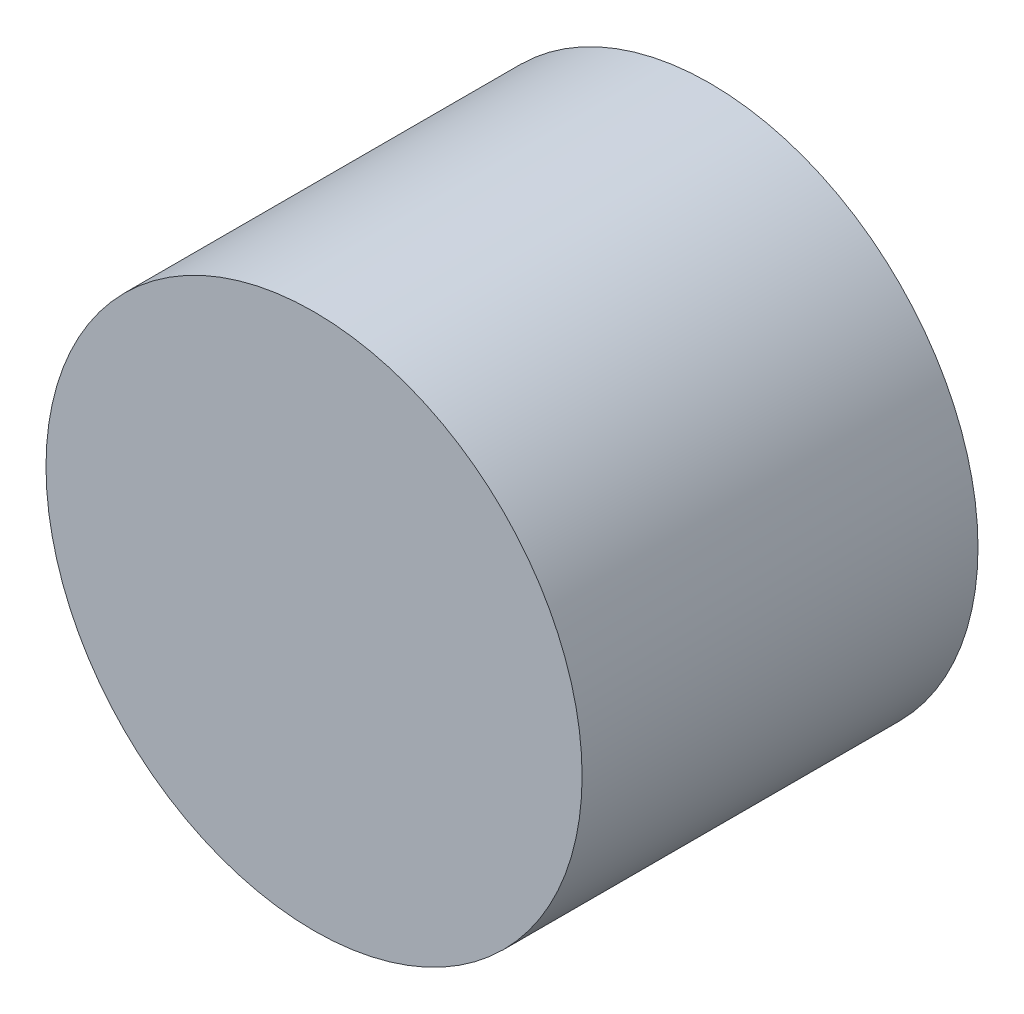
ISO-10303-21;
HEADER;
FILE_DESCRIPTION(('STEP AP214'),'2;1');
FILE_NAME('part.step','',(''),(''),'','','');
FILE_SCHEMA(('AUTOMOTIVE_DESIGN { 1 0 10303 214 1 1 1 1 }'));
ENDSEC;
DATA;
#1=APPLICATION_CONTEXT('core data for automotive mechanical design processes');
#2=APPLICATION_PROTOCOL_DEFINITION('international standard','automotive_design',2000,#1);
#3=PRODUCT_CONTEXT('',#1,'mechanical');
#4=PRODUCT('Part','Part','',(#3));
#5=PRODUCT_RELATED_PRODUCT_CATEGORY('part','',(#4));
#6=PRODUCT_DEFINITION_FORMATION('','',#4);
#7=PRODUCT_DEFINITION_CONTEXT('part definition',#1,'design');
#8=PRODUCT_DEFINITION('design','',#6,#7);
#9=PRODUCT_DEFINITION_SHAPE('','',#8);
#10=(LENGTH_UNIT() NAMED_UNIT(*) SI_UNIT(.MILLI.,.METRE.));
#11=(NAMED_UNIT(*) PLANE_ANGLE_UNIT() SI_UNIT($,.RADIAN.));
#12=(NAMED_UNIT(*) SI_UNIT($,.STERADIAN.) SOLID_ANGLE_UNIT());
#13=UNCERTAINTY_MEASURE_WITH_UNIT(LENGTH_MEASURE(1.E-05),#10,'distance_accuracy_value','');
#14=(GEOMETRIC_REPRESENTATION_CONTEXT(3) GLOBAL_UNCERTAINTY_ASSIGNED_CONTEXT((#13)) GLOBAL_UNIT_ASSIGNED_CONTEXT((#10,
#11,#12)) REPRESENTATION_CONTEXT('',''));
#15=CARTESIAN_POINT('',(0.,0.,0.));
#16=DIRECTION('',(0.,0.,1.));
#17=DIRECTION('',(1.,0.,0.));
#18=AXIS2_PLACEMENT_3D('',#15,#16,#17);
#19=CARTESIAN_POINT('',(0.,0.,152.4));
#20=DIRECTION('',(0.,0.,-1.));
#21=DIRECTION('',(-1.,0.,0.));
#22=AXIS2_PLACEMENT_3D('',#19,#20,#21);
#23=CYLINDRICAL_SURFACE('',#22,103.1875);
#24=CARTESIAN_POINT('',(-103.1875,0.,139.065));
#25=CARTESIAN_POINT('',(-103.187500151415,0.142631372121081,139.064998888755));
#26=CARTESIAN_POINT('',(-103.187203653749,0.285244835015824,139.071009421524));
#27=CARTESIAN_POINT('',(-103.186026268978,0.569504401507023,139.095008963457));
#28=CARTESIAN_POINT('',(-103.185145231413,0.711150246556222,139.113001056637));
#29=CARTESIAN_POINT('',(-103.182822393332,0.992540886629144,139.16086013933));
#30=CARTESIAN_POINT('',(-103.181380106072,1.1322839222726,139.190737436761));
#31=CARTESIAN_POINT('',(-103.177975153852,1.40880279631308,139.26216551732));
#32=CARTESIAN_POINT('',(-103.176012298689,1.54557753035996,139.303720567561));
#33=CARTESIAN_POINT('',(-103.171624090645,1.81501490925101,139.398160822931));
#34=CARTESIAN_POINT('',(-103.169199144967,1.94768105588709,139.45103605753));
#35=CARTESIAN_POINT('',(-103.163953366594,2.2081341042211,139.567782768655));
#36=CARTESIAN_POINT('',(-103.161132388254,2.33591918876159,139.631658292629));
#37=CARTESIAN_POINT('',(-103.155176965172,2.58557649722408,139.769895261551));
#38=CARTESIAN_POINT('',(-103.15204271159,2.70745226036297,139.844250323161));
#39=CARTESIAN_POINT('',(-103.145546789564,2.94455543763611,140.002977088138));
#40=CARTESIAN_POINT('',(-103.142185037538,3.05978037916763,140.087352481612));
#41=CARTESIAN_POINT('',(-103.13532863709,3.28277251533764,140.265543337055));
#42=CARTESIAN_POINT('',(-103.13183392416,3.39053601667479,140.359363418414));
#43=CARTESIAN_POINT('',(-103.124810895109,3.59781807442654,140.555780169412));
#44=CARTESIAN_POINT('',(-103.121282567054,3.69733357088112,140.658380067874));
#45=CARTESIAN_POINT('',(-103.114294815843,3.88733825067712,140.871564210351));
#46=CARTESIAN_POINT('',(-103.110835370465,3.97783038420558,140.982145824227));
#47=CARTESIAN_POINT('',(-103.104081052368,4.14921518776462,141.21058181232));
#48=CARTESIAN_POINT('',(-103.100786240874,4.23010430171609,141.328438856285));
#49=CARTESIAN_POINT('',(-103.094455750358,4.38167862508714,141.570569136519));
#50=CARTESIAN_POINT('',(-103.09142010347,4.45236256987633,141.694843165399));
#51=CARTESIAN_POINT('',(-103.085693593043,4.58303519547948,141.948955458504));
#52=CARTESIAN_POINT('',(-103.08300285731,4.64301991489054,142.078795761673));
#53=CARTESIAN_POINT('',(-103.07804518701,4.75181347138169,142.343038567699));
#54=CARTESIAN_POINT('',(-103.075778093735,4.80062649520614,142.477439339704));
#55=CARTESIAN_POINT('',(-103.071729669338,4.88677088772843,142.749893200121));
#56=CARTESIAN_POINT('',(-103.069948517685,4.92409801505229,142.887947617319));
#57=CARTESIAN_POINT('',(-103.065420623482,5.0183078092816,143.305798211479));
#58=CARTESIAN_POINT('',(-103.063479636425,5.05762694948216,143.589788447279));
#59=CARTESIAN_POINT('',(-103.061983730045,5.08801137906633,144.160190345331));
#60=CARTESIAN_POINT('',(-103.062428792336,5.07907704026065,144.446601988907));
#61=CARTESIAN_POINT('',(-103.065649104325,5.01330264183446,145.013642644917));
#62=CARTESIAN_POINT('',(-103.068422327002,4.95650425504788,145.294276470141));
#63=CARTESIAN_POINT('',(-103.075984277462,4.79666193899238,145.842010442943));
#64=CARTESIAN_POINT('',(-103.08077301357,4.69361781875652,146.109110534631));
#65=CARTESIAN_POINT('',(-103.091828301543,4.44416593306877,146.62234284411));
#66=CARTESIAN_POINT('',(-103.098095500979,4.29773915873167,146.868465809398));
#67=CARTESIAN_POINT('',(-103.111400751563,3.96569114295037,147.332652498442));
#68=CARTESIAN_POINT('',(-103.118438807977,3.7800696338145,147.550716030543));
#69=CARTESIAN_POINT('',(-103.132501500655,3.37466632510694,147.952837424399));
#70=CARTESIAN_POINT('',(-103.139526114705,3.15484842653214,148.136858895437));
#71=CARTESIAN_POINT('',(-103.15276297232,2.68741896509778,148.46539180607));
#72=CARTESIAN_POINT('',(-103.158975215688,2.43980739553554,148.609903236137));
#73=CARTESIAN_POINT('',(-103.169887456383,1.92379816008036,148.855310470094));
#74=CARTESIAN_POINT('',(-103.174587409886,1.65539989210552,148.956205010074));
#75=CARTESIAN_POINT('',(-103.181944731958,1.10544552227457,149.111490659046));
#76=CARTESIAN_POINT('',(-103.184602115353,0.823889515943945,149.165882105597));
#77=CARTESIAN_POINT('',(-103.187572897104,0.255927948834445,149.226572760997));
#78=CARTESIAN_POINT('',(-103.187888748808,-0.030472220910987,149.232922306065));
#79=CARTESIAN_POINT('',(-103.186147382861,-0.600269980655729,149.197480263614));
#80=CARTESIAN_POINT('',(-103.184090172815,-0.883667580274095,149.155688830366));
#81=CARTESIAN_POINT('',(-103.177835978181,-1.43927456809353,149.025192818601));
#82=CARTESIAN_POINT('',(-103.17364004166,-1.71148936580245,148.936511217452));
#83=CARTESIAN_POINT('',(-103.163580819853,-2.23717017467884,148.71477543735));
#84=CARTESIAN_POINT('',(-103.157717525265,-2.49063608123643,148.581721010839));
#85=CARTESIAN_POINT('',(-103.144977107741,-2.97185532359965,148.274887869533));
#86=CARTESIAN_POINT('',(-103.138099146399,-3.19958711817512,148.101075406208));
#87=CARTESIAN_POINT('',(-103.12410682101,-3.62265697837497,147.717708392459));
#88=CARTESIAN_POINT('',(-103.116992455491,-3.81799484216308,147.508153619353));
#89=CARTESIAN_POINT('',(-103.103322152082,-4.17090172360493,147.059037769356));
#90=CARTESIAN_POINT('',(-103.096766698766,-4.32843817815143,146.819451090712));
#91=CARTESIAN_POINT('',(-103.084961231523,-4.60104628484199,146.317187664686));
#92=CARTESIAN_POINT('',(-103.079711212045,-4.71611811757805,146.054511015506));
#93=CARTESIAN_POINT('',(-103.071111433613,-4.90047938268375,145.51369771608));
#94=CARTESIAN_POINT('',(-103.0677608126,-4.96978958675047,145.235568142325));
#95=CARTESIAN_POINT('',(-103.063337676401,-5.06070695371466,144.671447365657));
#96=CARTESIAN_POINT('',(-103.062265148805,-5.08231437648335,144.385456205579));
#97=CARTESIAN_POINT('',(-103.062449160748,-5.07854345269606,143.957228251136));
#98=CARTESIAN_POINT('',(-103.062809306697,-5.07125597193193,143.814611149393));
#99=CARTESIAN_POINT('',(-103.064112314452,-5.0447119978978,143.530512107349));
#100=CARTESIAN_POINT('',(-103.065054960875,-5.02545992855482,143.389029767046));
#101=CARTESIAN_POINT('',(-103.067497610167,-4.97510983766429,143.108150007162));
#102=CARTESIAN_POINT('',(-103.06899781923,-4.94400743359526,142.96875337877));
#103=CARTESIAN_POINT('',(-103.072511923201,-4.87019585110399,142.693126781498));
#104=CARTESIAN_POINT('',(-103.074525628808,-4.82749094959427,142.556895665793));
#105=CARTESIAN_POINT('',(-103.079010733588,-4.73075524291737,142.288466511875));
#106=CARTESIAN_POINT('',(-103.081482304172,-4.67672019510807,142.156270005748));
#107=CARTESIAN_POINT('',(-103.086811446397,-4.55774118514515,141.896947840356));
#108=CARTESIAN_POINT('',(-103.089668875654,-4.49280124482564,141.769820332906));
#109=CARTESIAN_POINT('',(-103.095690433721,-4.35243654725351,141.5214429863));
#110=CARTESIAN_POINT('',(-103.098854665244,-4.2770082749192,141.400195136115));
#111=CARTESIAN_POINT('',(-103.10539810872,-4.11624871720367,141.164524340898));
#112=CARTESIAN_POINT('',(-103.108777241233,-4.03092108161594,141.05009890392));
#113=CARTESIAN_POINT('',(-103.115660425685,-3.85082580404862,140.828687009367));
#114=CARTESIAN_POINT('',(-103.119164636827,-3.75604583419034,140.721710583847));
#115=CARTESIAN_POINT('',(-103.126193041908,-3.55784922765439,140.516159310502));
#116=CARTESIAN_POINT('',(-103.12971722802,-3.45443578194912,140.417581385531));
#117=CARTESIAN_POINT('',(-103.136689145631,-3.23960833999509,140.229423566644));
#118=CARTESIAN_POINT('',(-103.140136828745,-3.12818945931852,140.139849247511));
#119=CARTESIAN_POINT('',(-103.146854450022,-2.89824017675428,139.97043524129));
#120=CARTESIAN_POINT('',(-103.150124453264,-2.77971241253838,139.890591976538));
#121=CARTESIAN_POINT('',(-103.156399507786,-2.53618789937477,139.741070774998));
#122=CARTESIAN_POINT('',(-103.159404205379,-2.41118285723246,139.671406329262));
#123=CARTESIAN_POINT('',(-103.165057360597,-2.15578380718025,139.542888987996));
#124=CARTESIAN_POINT('',(-103.167705948201,-2.02539178836163,139.484032144802));
#125=CARTESIAN_POINT('',(-103.172570772015,-1.76021624171917,139.377565452785));
#126=CARTESIAN_POINT('',(-103.174787384329,-1.62543665440706,139.329945812464));
#127=CARTESIAN_POINT('',(-103.178727762388,-1.35238328488557,139.246239879668));
#128=CARTESIAN_POINT('',(-103.180451655582,-1.21411041636088,139.21015060439));
#129=CARTESIAN_POINT('',(-103.183741267381,-0.898196617271779,139.141782728285));
#130=CARTESIAN_POINT('',(-103.185145594516,-0.719783385497422,139.11301439959));
#131=CARTESIAN_POINT('',(-103.187024864667,-0.360903880809778,139.074623746248));
#132=CARTESIAN_POINT('',(-103.18749980845,-0.180437609591555,139.065001405794));
#133=CARTESIAN_POINT('',(-103.1875,0.,139.065));
#134=B_SPLINE_CURVE_WITH_KNOTS('',3,(#24,#25,#26,#27,#28,#29,#30,#31,#32,#33,#34,#35,#36,#37,
#38,#39,#40,#41,#42,#43,#44,#45,#46,#47,#48,#49,#50,#51,#52,#53,#54,#55,#56,#57,#58,#59,#60,#61,
#62,#63,#64,#65,#66,#67,#68,#69,#70,#71,#72,#73,#74,#75,#76,#77,#78,#79,#80,#81,#82,#83,#84,#85,
#86,#87,#88,#89,#90,#91,#92,#93,#94,#95,#96,#97,#98,#99,#100,#101,#102,#103,#104,#105,#106,#107,
#108,#109,#110,#111,#112,#113,#114,#115,#116,#117,#118,#119,#120,#121,#122,#123,#124,#125,#126,
#127,#128,#129,#130,#131,#132,#133),.UNSPECIFIED.,.T.,.F.,(4,2,2,2,2,2,2,2,2,2,2,2,2,2,2,2,2,2,
2,2,2,2,2,2,2,2,2,2,2,2,2,2,2,2,2,2,2,2,2,2,2,2,2,2,2,2,2,2,2,2,2,2,2,2,4),(0.,
0.427736465843772,0.855583072213784,1.28380155745951,1.71217671996561,2.14017612144384,
2.56833333879156,2.99623087345732,3.4242864780366,3.85255247101834,4.28097664345727,
4.70926028021266,5.13770202255323,5.56619681215302,5.99484992469173,6.42334212965267,
6.8519923737127,7.70767005189618,8.56334113677941,9.41826800040178,10.2731983943881,
11.1285039468138,11.9838153409825,12.8400358389822,13.6962565434672,14.5525020574678,
15.4087413560716,16.2640833998998,17.119422702719,17.9743432555417,18.8292685780544,
19.6849043124388,20.5405453778168,21.3969208894424,22.2532927590638,23.1092756445241,
23.9652538668211,24.3932484817292,24.8210849389754,25.249079773627,25.6769170543785,
26.104914828419,26.5327550978718,26.9607391017675,27.3885658108348,27.8169579821917,
28.2451925129276,28.6736905821011,29.1020306337986,29.5309333572493,29.9596791035057,
30.3880498726465,30.8163097361803,31.3574235739152,31.8985369649191),.UNSPECIFIED.);
#135=CARTESIAN_POINT('',(-103.1875,0.,139.065));
#136=VERTEX_POINT('',#135);
#137=EDGE_CURVE('E50',#136,#136,#134,.T.);
#138=ORIENTED_EDGE('',*,*,#137,.T.);
#139=EDGE_LOOP('',(#138));
#140=FACE_BOUND('',#139,.T.);
#141=CARTESIAN_POINT('',(0.,0.,152.4));
#142=DIRECTION('',(0.,0.,1.));
#143=DIRECTION('',(1.,0.,0.));
#144=AXIS2_PLACEMENT_3D('',#141,#142,#143);
#145=CIRCLE('',#144,103.1875);
#146=CARTESIAN_POINT('',(103.1875,0.,152.4));
#147=VERTEX_POINT('',#146);
#148=EDGE_CURVE('E11',#147,#147,#145,.T.);
#149=ORIENTED_EDGE('',*,*,#148,.F.);
#150=EDGE_LOOP('',(#149));
#151=FACE_BOUND('',#150,.T.);
#152=CARTESIAN_POINT('',(0.,0.,0.));
#153=DIRECTION('',(0.,0.,1.));
#154=DIRECTION('',(1.,0.,0.));
#155=AXIS2_PLACEMENT_3D('',#152,#153,#154);
#156=CIRCLE('',#155,103.1875);
#157=CARTESIAN_POINT('',(103.1875,0.,0.));
#158=VERTEX_POINT('',#157);
#159=EDGE_CURVE('E37',#158,#158,#156,.T.);
#160=ORIENTED_EDGE('',*,*,#159,.T.);
#161=EDGE_LOOP('',(#160));
#162=FACE_BOUND('',#161,.T.);
#163=ADVANCED_FACE('F33',(#140,#151,#162),#23,.T.);
#164=CARTESIAN_POINT('',(0.,0.,152.4));
#165=DIRECTION('',(0.,0.,1.));
#166=DIRECTION('',(1.,0.,0.));
#167=AXIS2_PLACEMENT_3D('',#164,#165,#166);
#168=PLANE('',#167);
#169=ORIENTED_EDGE('',*,*,#148,.T.);
#170=EDGE_LOOP('',(#169));
#171=FACE_BOUND('',#170,.T.);
#172=ADVANCED_FACE('F77',(#171),#168,.T.);
#173=CARTESIAN_POINT('',(0.,0.,0.));
#174=DIRECTION('',(0.,0.,1.));
#175=DIRECTION('',(1.,0.,0.));
#176=AXIS2_PLACEMENT_3D('',#173,#174,#175);
#177=PLANE('',#176);
#178=CARTESIAN_POINT('',(0.,0.,0.));
#179=DIRECTION('',(0.,0.,-1.));
#180=DIRECTION('',(-1.,0.,0.));
#181=AXIS2_PLACEMENT_3D('',#178,#179,#180);
#182=CIRCLE('',#181,101.6);
#183=CARTESIAN_POINT('',(-101.6,0.,0.));
#184=VERTEX_POINT('',#183);
#185=EDGE_CURVE('E53',#184,#184,#182,.T.);
#186=ORIENTED_EDGE('',*,*,#185,.F.);
#187=EDGE_LOOP('',(#186));
#188=FACE_BOUND('',#187,.T.);
#189=ORIENTED_EDGE('',*,*,#159,.F.);
#190=EDGE_LOOP('',(#189));
#191=FACE_BOUND('',#190,.T.);
#192=ADVANCED_FACE('F75',(#188,#191),#177,.F.);
#193=CARTESIAN_POINT('',(0.,0.,149.225));
#194=DIRECTION('',(0.,0.,-1.));
#195=DIRECTION('',(-1.,0.,0.));
#196=AXIS2_PLACEMENT_3D('',#193,#194,#195);
#197=CYLINDRICAL_SURFACE('',#196,101.6);
#198=CARTESIAN_POINT('',(0.,0.,149.225));
#199=DIRECTION('',(0.,0.,-1.));
#200=DIRECTION('',(-1.,0.,0.));
#201=AXIS2_PLACEMENT_3D('',#198,#199,#200);
#202=CIRCLE('',#201,101.6);
#203=CARTESIAN_POINT('',(-101.6,0.,149.225));
#204=VERTEX_POINT('',#203);
#205=EDGE_CURVE('E90',#204,#204,#202,.T.);
#206=ORIENTED_EDGE('',*,*,#205,.F.);
#207=CARTESIAN_POINT('',(-101.6,0.,149.225));
#208=CARTESIAN_POINT('',(-101.600000154136,0.142628448948381,149.225001114024));
#209=CARTESIAN_POINT('',(-101.599699035873,0.28523895392685,149.218990826308));
#210=CARTESIAN_POINT('',(-101.598503303603,0.569492583703744,149.194992282981));
#211=CARTESIAN_POINT('',(-101.597608536897,0.711135450134032,149.177000945607));
#212=CARTESIAN_POINT('',(-101.595249502238,0.992520011782608,149.129143925851));
#213=CARTESIAN_POINT('',(-101.593784740362,1.13225994904953,149.09926794448));
#214=CARTESIAN_POINT('',(-101.590326728445,1.40877264306323,149.027843083053));
#215=CARTESIAN_POINT('',(-101.588333285234,1.54554429545272,148.986289936047));
#216=CARTESIAN_POINT('',(-101.583876692044,1.81497544989044,148.891854152167));
#217=CARTESIAN_POINT('',(-101.581413956091,1.94763845768878,148.838981496731));
#218=CARTESIAN_POINT('',(-101.576086420425,2.20808539867414,148.722240603529));
#219=CARTESIAN_POINT('',(-101.573221472792,2.33586751476041,148.658368318546));
#220=CARTESIAN_POINT('',(-101.567173211792,2.58551922043088,148.520138452001));
#221=CARTESIAN_POINT('',(-101.56399009246,2.70739234703168,148.44578724973));
#222=CARTESIAN_POINT('',(-101.557392874425,2.94449066880348,148.287068806018));
#223=CARTESIAN_POINT('',(-101.553978690829,3.05971339145307,148.202697874582));
#224=CARTESIAN_POINT('',(-101.54701524547,3.28270429376562,148.024514350856));
#225=CARTESIAN_POINT('',(-101.543465915017,3.3904686019369,147.930696916213));
#226=CARTESIAN_POINT('',(-101.536333093151,3.59775254562183,147.734285469908));
#227=CARTESIAN_POINT('',(-101.532749589605,3.69726912125101,147.631688229403));
#228=CARTESIAN_POINT('',(-101.525652528987,3.88727629303223,147.418509316596));
#229=CARTESIAN_POINT('',(-101.522138949359,3.97776983875317,147.307930274005));
#230=CARTESIAN_POINT('',(-101.515278899668,4.14915782207247,147.079499249877));
#231=CARTESIAN_POINT('',(-101.511932491774,4.23004870374,146.961644598537));
#232=CARTESIAN_POINT('',(-101.505502773985,4.38162814311708,146.71951686124));
#233=CARTESIAN_POINT('',(-101.502419500993,4.4523152707636,146.595242878918));
#234=CARTESIAN_POINT('',(-101.496603113242,4.5829942241108,146.341130151444));
#235=CARTESIAN_POINT('',(-101.493870128286,4.6429820882953,146.211289367104));
#236=CARTESIAN_POINT('',(-101.488834581887,4.75178180605201,145.947045078199));
#237=CARTESIAN_POINT('',(-101.486531859199,4.80059784793397,145.812643305318));
#238=CARTESIAN_POINT('',(-101.482419778862,4.88674806967021,145.540186937967));
#239=CARTESIAN_POINT('',(-101.480610603486,4.92407800821141,145.402131014568));
#240=CARTESIAN_POINT('',(-101.476011499139,5.01829416160935,144.984282420569));
#241=CARTESIAN_POINT('',(-101.474039896822,5.0576176243489,144.700295295333));
#242=CARTESIAN_POINT('',(-101.47252008796,5.08801150740691,144.129898668874));
#243=CARTESIAN_POINT('',(-101.47297186229,5.07908230851556,143.843489186784));
#244=CARTESIAN_POINT('',(-101.476242027412,5.01331986205363,143.276460137062));
#245=CARTESIAN_POINT('',(-101.479058294402,4.9565296034074,142.995835605025));
#246=CARTESIAN_POINT('',(-101.486737778106,4.79670702699053,142.448118852186));
#247=CARTESIAN_POINT('',(-101.49160100347,4.6936745138183,142.181026688574));
#248=CARTESIAN_POINT('',(-101.502828430118,4.4442475074045,141.667804417368));
#249=CARTESIAN_POINT('',(-101.509193309727,4.29783341021052,141.421683851632));
#250=CARTESIAN_POINT('',(-101.522706047622,3.96581248157744,140.957499235691));
#251=CARTESIAN_POINT('',(-101.529853911432,3.78020537354526,140.739435383505));
#252=CARTESIAN_POINT('',(-101.544136405469,3.37482478740512,140.337302976237));
#253=CARTESIAN_POINT('',(-101.551271012593,3.15501407169819,140.153271956456));
#254=CARTESIAN_POINT('',(-101.564715309749,2.68759667538257,139.824718680093));
#255=CARTESIAN_POINT('',(-101.571024999578,2.43998998793677,139.68019643323));
#256=CARTESIAN_POINT('',(-101.582108625467,1.92398736308026,139.434766690559));
#257=CARTESIAN_POINT('',(-101.586882515408,1.65559080164989,139.333860504512));
#258=CARTESIAN_POINT('',(-101.594355843986,1.10563696030269,139.178551794698));
#259=CARTESIAN_POINT('',(-101.597055298152,0.824079778926374,139.124148922797));
#260=CARTESIAN_POINT('',(-101.600073525638,0.256122935526733,139.063437395803));
#261=CARTESIAN_POINT('',(-101.600394868924,-0.0302711636651651,139.057076822417));
#262=CARTESIAN_POINT('',(-101.598627482012,-0.600058610581794,139.092494962971));
#263=CARTESIAN_POINT('',(-101.596538759784,-0.88345196822779,139.134273517701));
#264=CARTESIAN_POINT('',(-101.590188154423,-1.43904794896554,139.264740982646));
#265=CARTESIAN_POINT('',(-101.585927369518,-1.71125615236057,139.353406187074));
#266=CARTESIAN_POINT('',(-101.57571234635,-2.23692671814448,139.575106109517));
#267=CARTESIAN_POINT('',(-101.56975809834,-2.4903889726163,139.708141082936));
#268=CARTESIAN_POINT('',(-101.556819567874,-2.97161119269974,140.014936817801));
#269=CARTESIAN_POINT('',(-101.5498344071,-3.19934894652198,140.188732381639));
#270=CARTESIAN_POINT('',(-101.535623655168,-3.62243408237137,140.572066046701));
#271=CARTESIAN_POINT('',(-101.528398062468,-3.81778125658356,140.781604377231));
#272=CARTESIAN_POINT('',(-101.514513470943,-4.17071523693272,141.230695100588));
#273=CARTESIAN_POINT('',(-101.507854979525,-4.32826845168155,141.470273907662));
#274=CARTESIAN_POINT('',(-101.495863591294,-4.60091104668213,141.972525509922));
#275=CARTESIAN_POINT('',(-101.490530688714,-4.7160006117395,142.235198204596));
#276=CARTESIAN_POINT('',(-101.48179480319,-4.90039602997594,142.77600390613));
#277=CARTESIAN_POINT('',(-101.478390917744,-4.96972329587838,143.054129616198));
#278=CARTESIAN_POINT('',(-101.473896845437,-5.06067509211743,143.618246144529));
#279=CARTESIAN_POINT('',(-101.472806645442,-5.08229989328172,143.904236918129));
#280=CARTESIAN_POINT('',(-101.472992247144,-5.07855478912392,144.332461621139));
#281=CARTESIAN_POINT('',(-101.473357584841,-5.0712762983197,144.475074812757));
#282=CARTESIAN_POINT('',(-101.47468008028,-5.0447509779481,144.759166773057));
#283=CARTESIAN_POINT('',(-101.475637019268,-5.0255085722374,144.900645941485));
#284=CARTESIAN_POINT('',(-101.478116972256,-4.97517844669892,145.181520111173));
#285=CARTESIAN_POINT('',(-101.479640195658,-4.94408634497705,145.320914321597));
#286=CARTESIAN_POINT('',(-101.483208374871,-4.87029596562282,145.596536889516));
#287=CARTESIAN_POINT('',(-101.48525313843,-4.82760196434196,145.732766393448));
#288=CARTESIAN_POINT('',(-101.489807538925,-4.73088866036488,146.001193098341));
#289=CARTESIAN_POINT('',(-101.492317349642,-4.67686512299109,146.133388770339));
#290=CARTESIAN_POINT('',(-101.497729043808,-4.55790965441235,146.392710238608));
#291=CARTESIAN_POINT('',(-101.500630782646,-4.4929817444784,146.519837882539));
#292=CARTESIAN_POINT('',(-101.506745804486,-4.35264154306464,146.768216604681));
#293=CARTESIAN_POINT('',(-101.509959191883,-4.27722573467195,146.889465693163));
#294=CARTESIAN_POINT('',(-101.516604371299,-4.11649142339167,147.125140168654));
#295=CARTESIAN_POINT('',(-101.520036082625,-4.03117656967877,147.239568046828));
#296=CARTESIAN_POINT('',(-101.527026570956,-3.85110404948479,147.460989828888));
#297=CARTESIAN_POINT('',(-101.530585513833,-3.75633374478979,147.567973449778));
#298=CARTESIAN_POINT('',(-101.537723784473,-3.55815589786552,147.773539953045));
#299=CARTESIAN_POINT('',(-101.541303104253,-3.4547515465557,147.872125912006));
#300=CARTESIAN_POINT('',(-101.548384185846,-3.23994160673031,148.060300639225));
#301=CARTESIAN_POINT('',(-101.55188589858,-3.1285311339769,148.149883833927));
#302=CARTESIAN_POINT('',(-101.558708892834,-2.89859782455224,148.319316403256));
#303=CARTESIAN_POINT('',(-101.562030240415,-2.78007762590815,148.399169355309));
#304=CARTESIAN_POINT('',(-101.568403979695,-2.53656544725232,148.548711821269));
#305=CARTESIAN_POINT('',(-101.571456008183,-2.41156507775115,148.618387690589));
#306=CARTESIAN_POINT('',(-101.577198327694,-2.15617413614993,148.746928197907));
#307=CARTESIAN_POINT('',(-101.579888750708,-2.02578555365899,148.805796783581));
#308=CARTESIAN_POINT('',(-101.58483054615,-1.76061552945236,148.912287160523));
#309=CARTESIAN_POINT('',(-101.587082300284,-1.62583802702769,148.95991873732));
#310=CARTESIAN_POINT('',(-101.591085300522,-1.35278755798043,149.043648559144));
#311=CARTESIAN_POINT('',(-101.592836675992,-1.21451550490525,149.079749785464));
#312=CARTESIAN_POINT('',(-101.596179630534,-0.898537693300436,149.148158508337));
#313=CARTESIAN_POINT('',(-101.5976069823,-0.720057739515976,149.176948829807));
#314=CARTESIAN_POINT('',(-101.599517069095,-0.361042275843153,149.215368862525));
#315=CARTESIAN_POINT('',(-101.599999804929,-0.18050676770886,149.224998590122));
#316=CARTESIAN_POINT('',(-101.6,0.,149.225));
#317=B_SPLINE_CURVE_WITH_KNOTS('',3,(#207,#208,#209,#210,#211,#212,#213,#214,#215,#216,#217,
#218,#219,#220,#221,#222,#223,#224,#225,#226,#227,#228,#229,#230,#231,#232,#233,#234,#235,#236,
#237,#238,#239,#240,#241,#242,#243,#244,#245,#246,#247,#248,#249,#250,#251,#252,#253,#254,#255,
#256,#257,#258,#259,#260,#261,#262,#263,#264,#265,#266,#267,#268,#269,#270,#271,#272,#273,#274,
#275,#276,#277,#278,#279,#280,#281,#282,#283,#284,#285,#286,#287,#288,#289,#290,#291,#292,#293,
#294,#295,#296,#297,#298,#299,#300,#301,#302,#303,#304,#305,#306,#307,#308,#309,#310,#311,#312,
#313,#314,#315,#316),.UNSPECIFIED.,.T.,.F.,(4,2,2,2,2,2,2,2,2,2,2,2,2,2,2,2,2,2,2,2,2,2,2,2,2,2,
2,2,2,2,2,2,2,2,2,2,2,2,2,2,2,2,2,2,2,2,2,2,2,2,2,2,2,2,4),(0.,0.427727634561355,
0.855565331635073,1.2837745946002,1.71214053335616,2.14013028747304,2.56827785446547,
2.99616589326035,3.42421200311625,3.85247866083568,4.28090349953902,4.70918782665551,
5.13763025884586,5.56613267935392,5.99479342955925,6.42329321087209,6.85195102895823,
7.70762169250228,8.56328560345491,9.41818177303221,10.2730815550987,11.1283682534677,
11.9836609879715,12.8398914833618,13.6961221893639,14.5523786055746,15.4086286115683,
16.2639531537583,17.1192748671301,17.9741645446197,18.8290591431721,19.6846863462528,
20.5403190387459,21.3967094256142,22.2530960853506,23.1090817470098,23.9650625488529,
24.3930441244666,24.8208675408087,25.2488493155359,25.6766735536586,26.1046579869569,
26.5324849350413,26.9604556940675,27.3882691846229,27.8166623551585,28.2448978975805,
28.6733969455619,29.1017379729798,29.5306481144591,29.9594012708832,30.3877796663033,
30.8160472101047,31.3573683786561,31.8986890853152),.UNSPECIFIED.);
#318=EDGE_CURVE('E44',#204,#204,#317,.T.);
#319=ORIENTED_EDGE('',*,*,#318,.T.);
#320=EDGE_LOOP('',(#206,#319));
#321=FACE_BOUND('',#320,.T.);
#322=ORIENTED_EDGE('',*,*,#185,.T.);
#323=EDGE_LOOP('',(#322));
#324=FACE_BOUND('',#323,.T.);
#325=ADVANCED_FACE('F62',(#321,#324),#197,.F.);
#326=CARTESIAN_POINT('',(0.,0.,149.225));
#327=DIRECTION('',(0.,0.,-1.));
#328=DIRECTION('',(-1.,0.,0.));
#329=AXIS2_PLACEMENT_3D('',#326,#327,#328);
#330=PLANE('',#329);
#331=ORIENTED_EDGE('',*,*,#205,.T.);
#332=EDGE_LOOP('',(#331));
#333=FACE_BOUND('',#332,.T.);
#334=ADVANCED_FACE('F68',(#333),#330,.T.);
#335=CARTESIAN_POINT('',(-103.1875,0.,144.145));
#336=DIRECTION('',(1.,0.,0.));
#337=DIRECTION('',(0.,0.,-1.));
#338=AXIS2_PLACEMENT_3D('',#335,#336,#337);
#339=CYLINDRICAL_SURFACE('',#338,5.07999999999999);
#340=ORIENTED_EDGE('',*,*,#318,.F.);
#341=EDGE_LOOP('',(#340));
#342=FACE_BOUND('',#341,.T.);
#343=ORIENTED_EDGE('',*,*,#137,.F.);
#344=EDGE_LOOP('',(#343));
#345=FACE_BOUND('',#344,.T.);
#346=ADVANCED_FACE('F45',(#342,#345),#339,.F.);
#347=CLOSED_SHELL('',(#163,#172,#192,#325,#334,#346));
#348=MANIFOLD_SOLID_BREP('B2',#347);
#349=ADVANCED_BREP_SHAPE_REPRESENTATION('',(#18,#348),#14);
#350=SHAPE_DEFINITION_REPRESENTATION(#9,#349);
ENDSEC;
END-ISO-10303-21;
